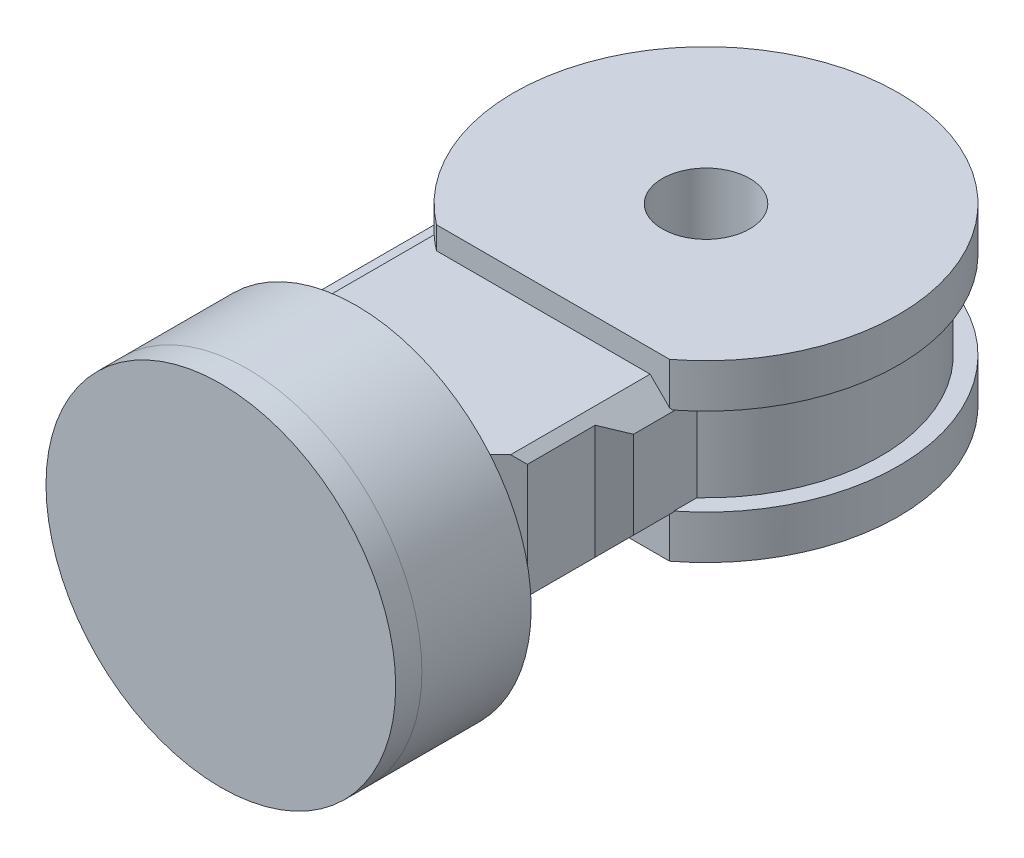
ISO-10303-21;
HEADER;
FILE_DESCRIPTION(('STEP AP214'),'2;1');
FILE_NAME('part.step','',(''),(''),'','','');
FILE_SCHEMA(('AUTOMOTIVE_DESIGN { 1 0 10303 214 1 1 1 1 }'));
ENDSEC;
DATA;
#1=APPLICATION_CONTEXT('core data for automotive mechanical design processes');
#2=APPLICATION_PROTOCOL_DEFINITION('international standard','automotive_design',2000,#1);
#3=PRODUCT_CONTEXT('',#1,'mechanical');
#4=PRODUCT('Part','Part','',(#3));
#5=PRODUCT_RELATED_PRODUCT_CATEGORY('part','',(#4));
#6=PRODUCT_DEFINITION_FORMATION('','',#4);
#7=PRODUCT_DEFINITION_CONTEXT('part definition',#1,'design');
#8=PRODUCT_DEFINITION('design','',#6,#7);
#9=PRODUCT_DEFINITION_SHAPE('','',#8);
#10=(LENGTH_UNIT() NAMED_UNIT(*) SI_UNIT(.MILLI.,.METRE.));
#11=(NAMED_UNIT(*) PLANE_ANGLE_UNIT() SI_UNIT($,.RADIAN.));
#12=(NAMED_UNIT(*) SI_UNIT($,.STERADIAN.) SOLID_ANGLE_UNIT());
#13=UNCERTAINTY_MEASURE_WITH_UNIT(LENGTH_MEASURE(1.E-05),#10,'distance_accuracy_value','');
#14=(GEOMETRIC_REPRESENTATION_CONTEXT(3) GLOBAL_UNCERTAINTY_ASSIGNED_CONTEXT((#13)) GLOBAL_UNIT_ASSIGNED_CONTEXT((#10,
#11,#12)) REPRESENTATION_CONTEXT('',''));
#15=CARTESIAN_POINT('',(0.,0.,0.));
#16=DIRECTION('',(0.,0.,1.));
#17=DIRECTION('',(1.,0.,0.));
#18=AXIS2_PLACEMENT_3D('',#15,#16,#17);
#19=CARTESIAN_POINT('',(-5.87206947568004,-0.00427005103726535,80.));
#20=DIRECTION('',(0.,0.,-1.));
#21=DIRECTION('',(-1.,0.,0.));
#22=AXIS2_PLACEMENT_3D('',#19,#20,#21);
#23=CYLINDRICAL_SURFACE('',#22,17.5);
#24=DIRECTION('',(0.,0.,-1.));
#25=VECTOR('',#24,1.);
#26=CARTESIAN_POINT('',(-14.8859476641298,14.9957299489627,500000.));
#27=LINE('',#26,#25);
#28=CARTESIAN_POINT('',(-14.88594766434,14.9957299489627,80.));
#29=VERTEX_POINT('',#28);
#30=CARTESIAN_POINT('',(-14.88594766434,14.9957299489627,75.));
#31=VERTEX_POINT('',#30);
#32=EDGE_CURVE('E259',#29,#31,#27,.T.);
#33=ORIENTED_EDGE('',*,*,#32,.F.);
#34=CARTESIAN_POINT('',(-5.87206947568004,-0.00427005103726535,80.));
#35=DIRECTION('',(0.,0.,1.));
#36=DIRECTION('',(1.,0.,0.));
#37=AXIS2_PLACEMENT_3D('',#34,#35,#36);
#38=CIRCLE('',#37,17.5);
#39=CARTESIAN_POINT('',(-14.88594766434,-15.0042700510373,80.));
#40=VERTEX_POINT('',#39);
#41=EDGE_CURVE('E281',#40,#29,#38,.T.);
#42=ORIENTED_EDGE('',*,*,#41,.F.);
#43=DIRECTION('',(0.,0.,-1.));
#44=VECTOR('',#43,1.);
#45=CARTESIAN_POINT('',(-14.8859476641298,-15.0042700510373,500000.));
#46=LINE('',#45,#44);
#47=CARTESIAN_POINT('',(-14.88594766434,-15.0042700510373,75.));
#48=VERTEX_POINT('',#47);
#49=EDGE_CURVE('E264',#40,#48,#46,.T.);
#50=ORIENTED_EDGE('',*,*,#49,.T.);
#51=CARTESIAN_POINT('',(-5.87206947568004,-0.00427005103726535,75.));
#52=DIRECTION('',(0.,0.,1.));
#53=DIRECTION('',(1.,0.,0.));
#54=AXIS2_PLACEMENT_3D('',#51,#52,#53);
#55=CIRCLE('',#54,17.5);
#56=CARTESIAN_POINT('',(3.14180871297995,-15.0042700510373,75.));
#57=VERTEX_POINT('',#56);
#58=EDGE_CURVE('E269',#48,#57,#55,.T.);
#59=ORIENTED_EDGE('',*,*,#58,.T.);
#60=CARTESIAN_POINT('',(3.14180871297995,14.9957299489627,75.));
#61=VERTEX_POINT('',#60);
#62=EDGE_CURVE('E288',#57,#61,#55,.T.);
#63=ORIENTED_EDGE('',*,*,#62,.T.);
#64=EDGE_CURVE('E285',#61,#31,#55,.T.);
#65=ORIENTED_EDGE('',*,*,#64,.T.);
#66=EDGE_LOOP('',(#33,#42,#50,#59,#63,#65));
#67=FACE_BOUND('',#66,.T.);
#68=ADVANCED_FACE('F35',(#67),#23,.T.);
#69=CARTESIAN_POINT('',(-40.0988586620535,-15.0042700510373,75.));
#70=DIRECTION('',(0.,0.,-1.));
#71=DIRECTION('',(-1.,0.,0.));
#72=AXIS2_PLACEMENT_3D('',#69,#70,#71);
#73=PLANE('',#72);
#74=DIRECTION('',(1.,0.,0.));
#75=VECTOR('',#74,1.);
#76=CARTESIAN_POINT('',(27.2129675063833,-15.0042700510373,75.));
#77=LINE('',#76,#75);
#78=CARTESIAN_POINT('',(14.12793052432,-15.0042700510373,75.));
#79=VERTEX_POINT('',#78);
#80=EDGE_CURVE('E324',#57,#79,#77,.T.);
#81=ORIENTED_EDGE('',*,*,#80,.T.);
#82=DIRECTION('',(0.,1.,0.));
#83=VECTOR('',#82,1.);
#84=CARTESIAN_POINT('',(14.12793052432,-15.0042700510373,75.));
#85=LINE('',#84,#83);
#86=CARTESIAN_POINT('',(14.12793052432,14.9957299489627,75.));
#87=VERTEX_POINT('',#86);
#88=EDGE_CURVE('E426',#79,#87,#85,.T.);
#89=ORIENTED_EDGE('',*,*,#88,.T.);
#90=DIRECTION('',(-1.,0.,0.));
#91=VECTOR('',#90,1.);
#92=CARTESIAN_POINT('',(27.2129675063833,14.9957299489627,75.));
#93=LINE('',#92,#91);
#94=EDGE_CURVE('E330',#87,#61,#93,.T.);
#95=ORIENTED_EDGE('',*,*,#94,.T.);
#96=ORIENTED_EDGE('',*,*,#62,.F.);
#97=EDGE_LOOP('',(#81,#89,#95,#96));
#98=FACE_BOUND('',#97,.T.);
#99=ADVANCED_FACE('F517',(#98),#73,.F.);
#100=CARTESIAN_POINT('',(27.2129675063833,14.9957299489627,5.));
#101=DIRECTION('',(0.,1.,0.));
#102=DIRECTION('',(0.,0.,1.));
#103=AXIS2_PLACEMENT_3D('',#100,#101,#102);
#104=PLANE('',#103);
#105=DIRECTION('',(-0.707106781186547,0.,0.707106781186549));
#106=VECTOR('',#105,1.);
#107=CARTESIAN_POINT('',(55.6704490153516,14.9957299489627,33.4574815089682));
#108=LINE('',#107,#106);
#109=CARTESIAN_POINT('',(22.2129675063833,14.9957299489627,66.9149630179367));
#110=VERTEX_POINT('',#109);
#111=EDGE_CURVE('E429',#87,#110,#108,.F.);
#112=ORIENTED_EDGE('',*,*,#111,.T.);
#113=DIRECTION('',(0.,0.,-1.));
#114=VECTOR('',#113,1.);
#115=CARTESIAN_POINT('',(22.2129675063833,14.9957299489627,5.));
#116=LINE('',#115,#114);
#117=CARTESIAN_POINT('',(22.2129675063833,14.9957299489627,35.));
#118=VERTEX_POINT('',#117);
#119=EDGE_CURVE('E454',#110,#118,#116,.T.);
#120=ORIENTED_EDGE('',*,*,#119,.T.);
#121=DIRECTION('',(1.,0.,0.));
#122=VECTOR('',#121,1.);
#123=CARTESIAN_POINT('',(44.0697477523933,14.9957299489627,35.));
#124=LINE('',#123,#122);
#125=CARTESIAN_POINT('',(-26.6645832519468,14.9957299489627,35.));
#126=VERTEX_POINT('',#125);
#127=EDGE_CURVE('E385',#126,#118,#124,.T.);
#128=ORIENTED_EDGE('',*,*,#127,.F.);
#129=CARTESIAN_POINT('',(0.,14.9957299489627,0.));
#130=DIRECTION('',(0.,1.,0.));
#131=DIRECTION('',(0.,0.,1.));
#132=AXIS2_PLACEMENT_3D('',#129,#130,#131);
#133=CIRCLE('',#132,44.);
#134=CARTESIAN_POINT('',(-30.0988586620535,14.9957299489627,32.0945276837302));
#135=VERTEX_POINT('',#134);
#136=EDGE_CURVE('E336',#135,#126,#133,.T.);
#137=ORIENTED_EDGE('',*,*,#136,.F.);
#138=DIRECTION('',(0.,0.,-1.));
#139=VECTOR('',#138,1.);
#140=CARTESIAN_POINT('',(-30.0988586620535,14.9957299489627,84.7338096233384));
#141=LINE('',#140,#139);
#142=CARTESIAN_POINT('',(-30.0988586620535,14.9957299489627,80.0000000000001));
#143=VERTEX_POINT('',#142);
#144=EDGE_CURVE('E302',#143,#135,#141,.T.);
#145=ORIENTED_EDGE('',*,*,#144,.F.);
#146=DIRECTION('',(-1.,0.,0.));
#147=VECTOR('',#146,1.);
#148=CARTESIAN_POINT('',(-30.0988586620535,14.9957299489627,79.9999999999841));
#149=LINE('',#148,#147);
#150=EDGE_CURVE('E276',#29,#143,#149,.T.);
#151=ORIENTED_EDGE('',*,*,#150,.F.);
#152=ORIENTED_EDGE('',*,*,#32,.T.);
#153=EDGE_CURVE('E333',#61,#31,#93,.T.);
#154=ORIENTED_EDGE('',*,*,#153,.F.);
#155=ORIENTED_EDGE('',*,*,#94,.F.);
#156=EDGE_LOOP('',(#112,#120,#128,#137,#145,#151,#152,#154,#155));
#157=FACE_BOUND('',#156,.T.);
#158=ADVANCED_FACE('F557',(#157),#104,.T.);
#159=CARTESIAN_POINT('',(44.0697477523933,-19.84,35.));
#160=DIRECTION('',(0.,0.,-1.));
#161=DIRECTION('',(-1.,0.,0.));
#162=AXIS2_PLACEMENT_3D('',#159,#160,#161);
#163=PLANE('',#162);
#164=DIRECTION('',(0.,-1.,0.));
#165=VECTOR('',#164,1.);
#166=CARTESIAN_POINT('',(26.6645832519468,-9.84,35.));
#167=LINE('',#166,#165);
#168=CARTESIAN_POINT('',(26.6645832519468,-10.5526543054738,35.));
#169=VERTEX_POINT('',#168);
#170=CARTESIAN_POINT('',(26.6645832519468,-19.84,35.));
#171=VERTEX_POINT('',#170);
#172=EDGE_CURVE('E62',#169,#171,#167,.T.);
#173=ORIENTED_EDGE('',*,*,#172,.F.);
#174=DIRECTION('',(0.707106781186546,0.707106781186549,0.));
#175=VECTOR('',#174,1.);
#176=CARTESIAN_POINT('',(30.7234926549069,-6.49374490251366,35.));
#177=LINE('',#176,#175);
#178=CARTESIAN_POINT('',(22.2129675063833,-15.0042700510373,35.));
#179=VERTEX_POINT('',#178);
#180=EDGE_CURVE('E11',#169,#179,#177,.F.);
#181=ORIENTED_EDGE('',*,*,#180,.T.);
#182=DIRECTION('',(-1.,0.,0.));
#183=VECTOR('',#182,1.);
#184=CARTESIAN_POINT('',(44.0697477523933,-15.0042700510373,35.));
#185=LINE('',#184,#183);
#186=CARTESIAN_POINT('',(-26.6645832519468,-15.0042700510373,35.));
#187=VERTEX_POINT('',#186);
#188=EDGE_CURVE('E388',#179,#187,#185,.T.);
#189=ORIENTED_EDGE('',*,*,#188,.T.);
#190=DIRECTION('',(0.,-1.,0.));
#191=VECTOR('',#190,1.);
#192=CARTESIAN_POINT('',(-26.6645832519468,-9.84,35.));
#193=LINE('',#192,#191);
#194=CARTESIAN_POINT('',(-26.6645832519468,-19.84,35.));
#195=VERTEX_POINT('',#194);
#196=EDGE_CURVE('E363',#195,#187,#193,.F.);
#197=ORIENTED_EDGE('',*,*,#196,.F.);
#198=DIRECTION('',(-1.,0.,0.));
#199=VECTOR('',#198,1.);
#200=CARTESIAN_POINT('',(44.0697477523933,-19.84,35.));
#201=LINE('',#200,#199);
#202=EDGE_CURVE('E358',#171,#195,#201,.T.);
#203=ORIENTED_EDGE('',*,*,#202,.F.);
#204=EDGE_LOOP('',(#173,#181,#189,#197,#203));
#205=FACE_BOUND('',#204,.T.);
#206=ADVANCED_FACE('F571',(#205),#163,.F.);
#207=CARTESIAN_POINT('',(0.,-9.84,0.));
#208=DIRECTION('',(0.,1.,0.));
#209=DIRECTION('',(0.,0.,1.));
#210=AXIS2_PLACEMENT_3D('',#207,#208,#209);
#211=PLANE('',#210);
#212=DIRECTION('',(0.,0.,-1.));
#213=VECTOR('',#212,1.);
#214=CARTESIAN_POINT('',(27.2129675063833,-9.84,0.));
#215=LINE('',#214,#213);
#216=CARTESIAN_POINT('',(27.2129675063833,-9.84,34.5753438087972));
#217=VERTEX_POINT('',#216);
#218=CARTESIAN_POINT('',(27.2129675063833,-9.84,29.3164527099806));
#219=VERTEX_POINT('',#218);
#220=EDGE_CURVE('E345',#217,#219,#215,.T.);
#221=ORIENTED_EDGE('',*,*,#220,.F.);
#222=CARTESIAN_POINT('',(0.,-9.84,0.));
#223=DIRECTION('',(0.,1.,0.));
#224=DIRECTION('',(0.,0.,1.));
#225=AXIS2_PLACEMENT_3D('',#222,#223,#224);
#226=CIRCLE('',#225,44.);
#227=CARTESIAN_POINT('',(-43.454624110608,-9.84,6.90620325546293));
#228=VERTEX_POINT('',#227);
#229=EDGE_CURVE('E381',#217,#228,#226,.T.);
#230=ORIENTED_EDGE('',*,*,#229,.T.);
#231=DIRECTION('',(0.766044443118978,0.,0.64278760968654));
#232=VECTOR('',#231,1.);
#233=CARTESIAN_POINT('',(-21.3550451662288,-9.84,25.4499517968647));
#234=LINE('',#233,#232);
#235=CARTESIAN_POINT('',(-40.0988586620535,-9.84,9.72202480566247));
#236=VERTEX_POINT('',#235);
#237=EDGE_CURVE('E409',#236,#228,#234,.F.);
#238=ORIENTED_EDGE('',*,*,#237,.F.);
#239=DIRECTION('',(0.,0.,1.));
#240=VECTOR('',#239,1.);
#241=CARTESIAN_POINT('',(-40.0988586620535,-9.84,0.));
#242=LINE('',#241,#240);
#243=CARTESIAN_POINT('',(-40.0988586620535,-9.84,5.00000000000002));
#244=VERTEX_POINT('',#243);
#245=EDGE_CURVE('E356',#244,#236,#242,.T.);
#246=ORIENTED_EDGE('',*,*,#245,.F.);
#247=DIRECTION('',(-1.,0.,0.));
#248=VECTOR('',#247,1.);
#249=CARTESIAN_POINT('',(0.,-9.84,5.));
#250=LINE('',#249,#248);
#251=CARTESIAN_POINT('',(-39.6862696659689,-9.84,5.00000000000002));
#252=VERTEX_POINT('',#251);
#253=EDGE_CURVE('E355',#252,#244,#250,.T.);
#254=ORIENTED_EDGE('',*,*,#253,.F.);
#255=CARTESIAN_POINT('',(0.,-9.84,0.));
#256=DIRECTION('',(0.,1.,0.));
#257=DIRECTION('',(0.,0.,1.));
#258=AXIS2_PLACEMENT_3D('',#255,#256,#257);
#259=CIRCLE('',#258,40.);
#260=EDGE_CURVE('E373',#219,#252,#259,.T.);
#261=ORIENTED_EDGE('',*,*,#260,.F.);
#262=EDGE_LOOP('',(#221,#230,#238,#246,#254,#261));
#263=FACE_BOUND('',#262,.T.);
#264=ADVANCED_FACE('F599',(#263),#211,.T.);
#265=CARTESIAN_POINT('',(0.,-9.84,0.));
#266=DIRECTION('',(0.,-1.,0.));
#267=DIRECTION('',(0.,0.,-1.));
#268=AXIS2_PLACEMENT_3D('',#265,#266,#267);
#269=CYLINDRICAL_SURFACE('',#268,44.);
#270=CARTESIAN_POINT('',(0.,-19.84,0.));
#271=DIRECTION('',(0.,1.,0.));
#272=DIRECTION('',(0.,0.,1.));
#273=AXIS2_PLACEMENT_3D('',#270,#271,#272);
#274=CIRCLE('',#273,44.);
#275=EDGE_CURVE('E377',#171,#195,#274,.T.);
#276=ORIENTED_EDGE('',*,*,#275,.T.);
#277=ORIENTED_EDGE('',*,*,#196,.T.);
#278=CARTESIAN_POINT('',(0.,-15.0042700510373,0.));
#279=DIRECTION('',(0.,-1.,0.));
#280=DIRECTION('',(0.,0.,-1.));
#281=AXIS2_PLACEMENT_3D('',#278,#279,#280);
#282=CIRCLE('',#281,44.);
#283=CARTESIAN_POINT('',(-30.0988586620535,-15.0042700510373,32.0945276837302));
#284=VERTEX_POINT('',#283);
#285=EDGE_CURVE('E340',#187,#284,#282,.T.);
#286=ORIENTED_EDGE('',*,*,#285,.T.);
#287=CARTESIAN_POINT('',(0.,-15.0042700510372,0.));
#288=DIRECTION('',(0.,-1.,0.));
#289=DIRECTION('',(1.,0.,0.));
#290=AXIS2_PLACEMENT_3D('',#287,#288,#289);
#291=CIRCLE('',#290,44.);
#292=CARTESIAN_POINT('',(-43.454624110608,-15.0042700510373,6.90620325546295));
#293=VERTEX_POINT('',#292);
#294=EDGE_CURVE('E406',#284,#293,#291,.T.);
#295=ORIENTED_EDGE('',*,*,#294,.T.);
#296=DIRECTION('',(0.,-1.,0.));
#297=VECTOR('',#296,1.);
#298=CARTESIAN_POINT('',(-43.454624110608,-9.83999999999999,6.90620325546293));
#299=LINE('',#298,#297);
#300=EDGE_CURVE('E396',#293,#228,#299,.F.);
#301=ORIENTED_EDGE('',*,*,#300,.T.);
#302=ORIENTED_EDGE('',*,*,#229,.F.);
#303=DIRECTION('',(0.,-1.,0.));
#304=VECTOR('',#303,1.);
#305=CARTESIAN_POINT('',(27.2129675063833,-9.84,34.5753438087972));
#306=LINE('',#305,#304);
#307=CARTESIAN_POINT('',(27.2129675063833,-10.0042700510373,34.5753438087972));
#308=VERTEX_POINT('',#307);
#309=EDGE_CURVE('E348',#217,#308,#306,.T.);
#310=ORIENTED_EDGE('',*,*,#309,.T.);
#311=CARTESIAN_POINT('',(0.,-37.2172375574207,0.));
#312=DIRECTION('',(-0.70710678118655,0.707106781186546,0.));
#313=DIRECTION('',(-0.707106781186546,-0.707106781186549,0.));
#314=AXIS2_PLACEMENT_3D('',#311,#312,#313);
#315=ELLIPSE('',#314,62.2253967444164,44.);
#316=EDGE_CURVE('E47',#308,#169,#315,.F.);
#317=ORIENTED_EDGE('',*,*,#316,.T.);
#318=ORIENTED_EDGE('',*,*,#172,.T.);
#319=EDGE_LOOP('',(#276,#277,#286,#295,#301,#302,#310,#317,#318));
#320=FACE_BOUND('',#319,.T.);
#321=ADVANCED_FACE('F602',(#320),#269,.T.);
#322=CARTESIAN_POINT('',(0.,-19.84,0.));
#323=DIRECTION('',(0.,1.,0.));
#324=DIRECTION('',(0.,0.,1.));
#325=AXIS2_PLACEMENT_3D('',#322,#323,#324);
#326=PLANE('',#325);
#327=CARTESIAN_POINT('',(0.,-19.84,0.));
#328=DIRECTION('',(0.,1.,0.));
#329=DIRECTION('',(0.,0.,1.));
#330=AXIS2_PLACEMENT_3D('',#327,#328,#329);
#331=CIRCLE('',#330,10.);
#332=CARTESIAN_POINT('',(0.,-19.84,10.));
#333=VERTEX_POINT('',#332);
#334=EDGE_CURVE('E313',#333,#333,#331,.T.);
#335=ORIENTED_EDGE('',*,*,#334,.T.);
#336=EDGE_LOOP('',(#335));
#337=FACE_BOUND('',#336,.T.);
#338=ORIENTED_EDGE('',*,*,#275,.F.);
#339=ORIENTED_EDGE('',*,*,#202,.T.);
#340=EDGE_LOOP('',(#338,#339));
#341=FACE_BOUND('',#340,.T.);
#342=ADVANCED_FACE('F597',(#337,#341),#326,.F.);
#343=CARTESIAN_POINT('',(0.,10.16,0.));
#344=DIRECTION('',(0.,-1.,0.));
#345=DIRECTION('',(0.,0.,-1.));
#346=AXIS2_PLACEMENT_3D('',#343,#344,#345);
#347=CYLINDRICAL_SURFACE('',#346,40.);
#348=CARTESIAN_POINT('',(0.,10.16,0.));
#349=DIRECTION('',(0.,1.,0.));
#350=DIRECTION('',(0.,0.,1.));
#351=AXIS2_PLACEMENT_3D('',#348,#349,#350);
#352=CIRCLE('',#351,40.);
#353=CARTESIAN_POINT('',(27.048697455346,10.16,29.4680838530292));
#354=VERTEX_POINT('',#353);
#355=CARTESIAN_POINT('',(-39.6862696659689,10.16,5.00000000000002));
#356=VERTEX_POINT('',#355);
#357=EDGE_CURVE('E374',#354,#356,#352,.T.);
#358=ORIENTED_EDGE('',*,*,#357,.F.);
#359=CARTESIAN_POINT('',(0.,37.2086974553459,0.));
#360=DIRECTION('',(-0.707106781186546,-0.707106781186549,0.));
#361=DIRECTION('',(0.70710678118655,-0.707106781186546,0.));
#362=AXIS2_PLACEMENT_3D('',#359,#360,#361);
#363=ELLIPSE('',#362,56.5685424949236,40.);
#364=CARTESIAN_POINT('',(27.2129675063833,9.99572994896276,29.3164527099806));
#365=VERTEX_POINT('',#364);
#366=EDGE_CURVE('E468',#354,#365,#363,.F.);
#367=ORIENTED_EDGE('',*,*,#366,.T.);
#368=DIRECTION('',(0.,-1.,0.));
#369=VECTOR('',#368,1.);
#370=CARTESIAN_POINT('',(27.2129675063833,10.16,29.3164527099806));
#371=LINE('',#370,#369);
#372=EDGE_CURVE('E343',#365,#219,#371,.T.);
#373=ORIENTED_EDGE('',*,*,#372,.T.);
#374=ORIENTED_EDGE('',*,*,#260,.T.);
#375=DIRECTION('',(0.,-1.,0.));
#376=VECTOR('',#375,1.);
#377=CARTESIAN_POINT('',(-39.6862696659689,10.16,5.00000000000002));
#378=LINE('',#377,#376);
#379=EDGE_CURVE('E352',#252,#356,#378,.F.);
#380=ORIENTED_EDGE('',*,*,#379,.T.);
#381=EDGE_LOOP('',(#358,#367,#373,#374,#380));
#382=FACE_BOUND('',#381,.T.);
#383=ADVANCED_FACE('F590',(#382),#347,.T.);
#384=CARTESIAN_POINT('',(0.,10.16,0.));
#385=DIRECTION('',(0.,1.,0.));
#386=DIRECTION('',(0.,0.,1.));
#387=AXIS2_PLACEMENT_3D('',#384,#385,#386);
#388=PLANE('',#387);
#389=CARTESIAN_POINT('',(0.,10.16,0.));
#390=DIRECTION('',(0.,1.,0.));
#391=DIRECTION('',(0.,0.,1.));
#392=AXIS2_PLACEMENT_3D('',#389,#390,#391);
#393=CIRCLE('',#392,44.);
#394=CARTESIAN_POINT('',(27.048697455346,10.16,34.7040050422017));
#395=VERTEX_POINT('',#394);
#396=CARTESIAN_POINT('',(-43.454624110608,10.16,6.90620325546297));
#397=VERTEX_POINT('',#396);
#398=EDGE_CURVE('E369',#395,#397,#393,.T.);
#399=ORIENTED_EDGE('',*,*,#398,.F.);
#400=DIRECTION('',(0.,0.,1.));
#401=VECTOR('',#400,1.);
#402=CARTESIAN_POINT('',(27.048697455346,10.16,0.));
#403=LINE('',#402,#401);
#404=EDGE_CURVE('E465',#395,#354,#403,.F.);
#405=ORIENTED_EDGE('',*,*,#404,.T.);
#406=ORIENTED_EDGE('',*,*,#357,.T.);
#407=DIRECTION('',(-1.,0.,0.));
#408=VECTOR('',#407,1.);
#409=CARTESIAN_POINT('',(0.,10.16,5.));
#410=LINE('',#409,#408);
#411=CARTESIAN_POINT('',(-40.0988586620535,10.16,5.00000000000002));
#412=VERTEX_POINT('',#411);
#413=EDGE_CURVE('E391',#356,#412,#410,.T.);
#414=ORIENTED_EDGE('',*,*,#413,.T.);
#415=DIRECTION('',(0.,0.,1.));
#416=VECTOR('',#415,1.);
#417=CARTESIAN_POINT('',(-40.0988586620535,10.16,0.));
#418=LINE('',#417,#416);
#419=CARTESIAN_POINT('',(-40.0988586620535,10.16,9.72202480566249));
#420=VERTEX_POINT('',#419);
#421=EDGE_CURVE('E351',#412,#420,#418,.T.);
#422=ORIENTED_EDGE('',*,*,#421,.T.);
#423=DIRECTION('',(-0.766044443118978,0.,-0.64278760968654));
#424=VECTOR('',#423,1.);
#425=CARTESIAN_POINT('',(-30.0988586620535,10.16,18.1130211174353));
#426=LINE('',#425,#424);
#427=EDGE_CURVE('E394',#397,#420,#426,.F.);
#428=ORIENTED_EDGE('',*,*,#427,.F.);
#429=EDGE_LOOP('',(#399,#405,#406,#414,#422,#428));
#430=FACE_BOUND('',#429,.T.);
#431=ADVANCED_FACE('F587',(#430),#388,.F.);
#432=CARTESIAN_POINT('',(0.,20.16,0.));
#433=DIRECTION('',(0.,-1.,0.));
#434=DIRECTION('',(0.,0.,-1.));
#435=AXIS2_PLACEMENT_3D('',#432,#433,#434);
#436=CYLINDRICAL_SURFACE('',#435,44.);
#437=ORIENTED_EDGE('',*,*,#398,.T.);
#438=DIRECTION('',(0.,-1.,0.));
#439=VECTOR('',#438,1.);
#440=CARTESIAN_POINT('',(-43.454624110608,20.16,6.90620325546297));
#441=LINE('',#440,#439);
#442=CARTESIAN_POINT('',(-43.454624110608,14.9957299489627,6.90620325546297));
#443=VERTEX_POINT('',#442);
#444=EDGE_CURVE('E390',#397,#443,#441,.F.);
#445=ORIENTED_EDGE('',*,*,#444,.T.);
#446=EDGE_CURVE('E337',#443,#135,#133,.T.);
#447=ORIENTED_EDGE('',*,*,#446,.T.);
#448=ORIENTED_EDGE('',*,*,#136,.T.);
#449=DIRECTION('',(0.,-1.,0.));
#450=VECTOR('',#449,1.);
#451=CARTESIAN_POINT('',(-26.6645832519468,20.16,35.));
#452=LINE('',#451,#450);
#453=CARTESIAN_POINT('',(-26.6645832519468,20.16,35.));
#454=VERTEX_POINT('',#453);
#455=EDGE_CURVE('E361',#126,#454,#452,.F.);
#456=ORIENTED_EDGE('',*,*,#455,.T.);
#457=CARTESIAN_POINT('',(0.,20.16,0.));
#458=DIRECTION('',(0.,1.,0.));
#459=DIRECTION('',(0.,0.,1.));
#460=AXIS2_PLACEMENT_3D('',#457,#458,#459);
#461=CIRCLE('',#460,44.);
#462=CARTESIAN_POINT('',(26.6645832519468,20.16,35.));
#463=VERTEX_POINT('',#462);
#464=EDGE_CURVE('E370',#463,#454,#461,.T.);
#465=ORIENTED_EDGE('',*,*,#464,.F.);
#466=DIRECTION('',(0.,-1.,0.));
#467=VECTOR('',#466,1.);
#468=CARTESIAN_POINT('',(26.6645832519468,20.16,35.));
#469=LINE('',#468,#467);
#470=CARTESIAN_POINT('',(26.6645832519468,10.5441142033992,35.));
#471=VERTEX_POINT('',#470);
#472=EDGE_CURVE('E366',#463,#471,#469,.T.);
#473=ORIENTED_EDGE('',*,*,#472,.T.);
#474=CARTESIAN_POINT('',(0.,37.2086974553459,0.));
#475=DIRECTION('',(-0.707106781186546,-0.707106781186549,0.));
#476=DIRECTION('',(0.70710678118655,-0.707106781186546,0.));
#477=AXIS2_PLACEMENT_3D('',#474,#475,#476);
#478=ELLIPSE('',#477,62.225396744416,44.);
#479=EDGE_CURVE('E462',#471,#395,#478,.F.);
#480=ORIENTED_EDGE('',*,*,#479,.T.);
#481=EDGE_LOOP('',(#437,#445,#447,#448,#456,#465,#473,#480));
#482=FACE_BOUND('',#481,.T.);
#483=ADVANCED_FACE('F585',(#482),#436,.T.);
#484=CARTESIAN_POINT('',(0.,20.16,0.));
#485=DIRECTION('',(0.,1.,0.));
#486=DIRECTION('',(0.,0.,1.));
#487=AXIS2_PLACEMENT_3D('',#484,#485,#486);
#488=PLANE('',#487);
#489=CARTESIAN_POINT('',(0.,20.16,0.));
#490=DIRECTION('',(0.,1.,0.));
#491=DIRECTION('',(0.,0.,1.));
#492=AXIS2_PLACEMENT_3D('',#489,#490,#491);
#493=CIRCLE('',#492,10.);
#494=CARTESIAN_POINT('',(0.,20.16,10.));
#495=VERTEX_POINT('',#494);
#496=EDGE_CURVE('E317',#495,#495,#493,.T.);
#497=ORIENTED_EDGE('',*,*,#496,.F.);
#498=EDGE_LOOP('',(#497));
#499=FACE_BOUND('',#498,.T.);
#500=DIRECTION('',(-1.,0.,0.));
#501=VECTOR('',#500,1.);
#502=CARTESIAN_POINT('',(0.,20.16,35.));
#503=LINE('',#502,#501);
#504=EDGE_CURVE('E382',#463,#454,#503,.T.);
#505=ORIENTED_EDGE('',*,*,#504,.F.);
#506=ORIENTED_EDGE('',*,*,#464,.T.);
#507=EDGE_LOOP('',(#505,#506));
#508=FACE_BOUND('',#507,.T.);
#509=ADVANCED_FACE('F581',(#499,#508),#488,.T.);
#510=ORIENTED_EDGE('',*,*,#455,.F.);
#511=ORIENTED_EDGE('',*,*,#127,.T.);
#512=DIRECTION('',(-0.70710678118655,0.707106781186546,0.));
#513=VECTOR('',#512,1.);
#514=CARTESIAN_POINT('',(50.5592226038697,-13.3505251485236,35.));
#515=LINE('',#514,#513);
#516=EDGE_CURVE('E459',#118,#471,#515,.F.);
#517=ORIENTED_EDGE('',*,*,#516,.T.);
#518=ORIENTED_EDGE('',*,*,#472,.F.);
#519=ORIENTED_EDGE('',*,*,#504,.T.);
#520=EDGE_LOOP('',(#510,#511,#517,#518,#519));
#521=FACE_BOUND('',#520,.T.);
#522=ADVANCED_FACE('F567',(#521),#163,.F.);
#523=CARTESIAN_POINT('',(-40.0988586620535,-15.0042700510373,5.00000000000002));
#524=DIRECTION('',(-1.,0.,0.));
#525=DIRECTION('',(0.,-1.,0.));
#526=AXIS2_PLACEMENT_3D('',#523,#524,#525);
#527=PLANE('',#526);
#528=DIRECTION('',(0.,1.,0.));
#529=VECTOR('',#528,1.);
#530=CARTESIAN_POINT('',(-40.0988586620535,-15.0042700510373,9.72202480566248));
#531=LINE('',#530,#529);
#532=CARTESIAN_POINT('',(-40.0988586620535,-6.97369252550356,9.72202480566247));
#533=VERTEX_POINT('',#532);
#534=EDGE_CURVE('E291',#533,#236,#531,.F.);
#535=ORIENTED_EDGE('',*,*,#534,.F.);
#536=DIRECTION('',(0.,0.,-1.));
#537=VECTOR('',#536,1.);
#538=CARTESIAN_POINT('',(-40.0988586620535,-6.97369252550357,84.7338096233384));
#539=LINE('',#538,#537);
#540=CARTESIAN_POINT('',(-40.0988586620535,-6.97369252550357,80.0000000000001));
#541=VERTEX_POINT('',#540);
#542=EDGE_CURVE('E284',#541,#533,#539,.T.);
#543=ORIENTED_EDGE('',*,*,#542,.F.);
#544=DIRECTION('',(0.,-1.,0.));
#545=VECTOR('',#544,1.);
#546=CARTESIAN_POINT('',(-40.0988586620535,6.96515242342905,79.9999999999841));
#547=LINE('',#546,#545);
#548=CARTESIAN_POINT('',(-40.0988586620535,6.96515242342905,80.0000000000001));
#549=VERTEX_POINT('',#548);
#550=EDGE_CURVE('E232',#549,#541,#547,.T.);
#551=ORIENTED_EDGE('',*,*,#550,.F.);
#552=DIRECTION('',(0.,0.,1.));
#553=VECTOR('',#552,1.);
#554=CARTESIAN_POINT('',(-40.0988586620535,6.96515242342905,84.7338096233384));
#555=LINE('',#554,#553);
#556=CARTESIAN_POINT('',(-40.0988586620535,6.96515242342904,9.7220248056625));
#557=VERTEX_POINT('',#556);
#558=EDGE_CURVE('E303',#557,#549,#555,.T.);
#559=ORIENTED_EDGE('',*,*,#558,.F.);
#560=DIRECTION('',(0.,1.,0.));
#561=VECTOR('',#560,1.);
#562=CARTESIAN_POINT('',(-40.0988586620535,-15.0042700510373,9.72202480566248));
#563=LINE('',#562,#561);
#564=EDGE_CURVE('E312',#420,#557,#563,.F.);
#565=ORIENTED_EDGE('',*,*,#564,.F.);
#566=ORIENTED_EDGE('',*,*,#421,.F.);
#567=DIRECTION('',(0.,-1.,0.));
#568=VECTOR('',#567,1.);
#569=CARTESIAN_POINT('',(-40.0988586620535,-15.0042700510373,5.00000000000002));
#570=LINE('',#569,#568);
#571=EDGE_CURVE('E332',#412,#244,#570,.T.);
#572=ORIENTED_EDGE('',*,*,#571,.T.);
#573=ORIENTED_EDGE('',*,*,#245,.T.);
#574=EDGE_LOOP('',(#535,#543,#551,#559,#565,#566,#572,#573));
#575=FACE_BOUND('',#574,.T.);
#576=ADVANCED_FACE('F563',(#575),#527,.T.);
#577=CARTESIAN_POINT('',(27.2129675063833,-15.0042700510373,5.));
#578=DIRECTION('',(1.,0.,0.));
#579=DIRECTION('',(0.,0.,-1.));
#580=AXIS2_PLACEMENT_3D('',#577,#578,#579);
#581=PLANE('',#580);
#582=ORIENTED_EDGE('',*,*,#372,.F.);
#583=DIRECTION('',(0.,0.,1.));
#584=VECTOR('',#583,1.);
#585=CARTESIAN_POINT('',(27.2129675063833,9.99572994896276,5.));
#586=LINE('',#585,#584);
#587=CARTESIAN_POINT('',(27.2129675063833,9.99572994896275,43.805218586097));
#588=VERTEX_POINT('',#587);
#589=EDGE_CURVE('E439',#365,#588,#586,.T.);
#590=ORIENTED_EDGE('',*,*,#589,.T.);
#591=DIRECTION('',(0.,1.,0.));
#592=VECTOR('',#591,1.);
#593=CARTESIAN_POINT('',(27.2129675063833,-25.0042700510373,43.805218586097));
#594=LINE('',#593,#592);
#595=CARTESIAN_POINT('',(27.2129675063833,-10.0042700510373,43.805218586097));
#596=VERTEX_POINT('',#595);
#597=EDGE_CURVE('E316',#596,#588,#594,.T.);
#598=ORIENTED_EDGE('',*,*,#597,.F.);
#599=DIRECTION('',(0.,0.,-1.));
#600=VECTOR('',#599,1.);
#601=CARTESIAN_POINT('',(27.2129675063833,-10.0042700510373,5.));
#602=LINE('',#601,#600);
#603=EDGE_CURVE('E437',#596,#308,#602,.T.);
#604=ORIENTED_EDGE('',*,*,#603,.T.);
#605=ORIENTED_EDGE('',*,*,#309,.F.);
#606=ORIENTED_EDGE('',*,*,#220,.T.);
#607=EDGE_LOOP('',(#582,#590,#598,#604,#605,#606));
#608=FACE_BOUND('',#607,.T.);
#609=ADVANCED_FACE('F566',(#608),#581,.T.);
#610=CARTESIAN_POINT('',(27.2129675063833,-15.0042700510373,5.));
#611=DIRECTION('',(0.,-1.,0.));
#612=DIRECTION('',(0.,0.,-1.));
#613=AXIS2_PLACEMENT_3D('',#610,#611,#612);
#614=PLANE('',#613);
#615=ORIENTED_EDGE('',*,*,#188,.F.);
#616=DIRECTION('',(0.,0.,1.));
#617=VECTOR('',#616,1.);
#618=CARTESIAN_POINT('',(22.2129675063833,-15.0042700510373,5.));
#619=LINE('',#618,#617);
#620=CARTESIAN_POINT('',(22.2129675063834,-15.0042700510373,66.9149630179366));
#621=VERTEX_POINT('',#620);
#622=EDGE_CURVE('E456',#179,#621,#619,.T.);
#623=ORIENTED_EDGE('',*,*,#622,.T.);
#624=DIRECTION('',(0.707106781186547,0.,-0.707106781186549));
#625=VECTOR('',#624,1.);
#626=CARTESIAN_POINT('',(55.6704490153516,-15.0042700510373,33.4574815089682));
#627=LINE('',#626,#625);
#628=EDGE_CURVE('E435',#621,#79,#627,.F.);
#629=ORIENTED_EDGE('',*,*,#628,.T.);
#630=ORIENTED_EDGE('',*,*,#80,.F.);
#631=EDGE_CURVE('E329',#48,#57,#77,.T.);
#632=ORIENTED_EDGE('',*,*,#631,.F.);
#633=ORIENTED_EDGE('',*,*,#49,.F.);
#634=DIRECTION('',(1.,0.,0.));
#635=VECTOR('',#634,1.);
#636=CARTESIAN_POINT('',(-30.0988586620535,-15.0042700510373,79.9999999999841));
#637=LINE('',#636,#635);
#638=CARTESIAN_POINT('',(-30.0988586620535,-15.0042700510373,80.0000000000001));
#639=VERTEX_POINT('',#638);
#640=EDGE_CURVE('E266',#639,#40,#637,.T.);
#641=ORIENTED_EDGE('',*,*,#640,.F.);
#642=DIRECTION('',(0.,0.,1.));
#643=VECTOR('',#642,1.);
#644=CARTESIAN_POINT('',(-30.0988586620535,-15.0042700510373,84.7338096233384));
#645=LINE('',#644,#643);
#646=EDGE_CURVE('E294',#284,#639,#645,.T.);
#647=ORIENTED_EDGE('',*,*,#646,.F.);
#648=ORIENTED_EDGE('',*,*,#285,.F.);
#649=EDGE_LOOP('',(#615,#623,#629,#630,#632,#633,#641,#647,#648));
#650=FACE_BOUND('',#649,.T.);
#651=ADVANCED_FACE('F561',(#650),#614,.T.);
#652=CARTESIAN_POINT('',(-40.0988586620535,-15.0042700510373,5.00000000000002));
#653=DIRECTION('',(0.,0.,-1.));
#654=DIRECTION('',(-1.,0.,0.));
#655=AXIS2_PLACEMENT_3D('',#652,#653,#654);
#656=PLANE('',#655);
#657=ORIENTED_EDGE('',*,*,#379,.F.);
#658=ORIENTED_EDGE('',*,*,#253,.T.);
#659=ORIENTED_EDGE('',*,*,#571,.F.);
#660=ORIENTED_EDGE('',*,*,#413,.F.);
#661=EDGE_LOOP('',(#657,#658,#659,#660));
#662=FACE_BOUND('',#661,.T.);
#663=ADVANCED_FACE('F550',(#662),#656,.T.);
#664=CARTESIAN_POINT('',(24.12793052432,-25.0042700510373,49.4880973388311));
#665=DIRECTION('',(-1.,0.,0.));
#666=DIRECTION('',(0.,-1.,0.));
#667=AXIS2_PLACEMENT_3D('',#664,#665,#666);
#668=PLANE('',#667);
#669=DIRECTION('',(0.,1.,0.));
#670=VECTOR('',#669,1.);
#671=CARTESIAN_POINT('',(24.12793052432,-25.0042700510373,49.4880973388311));
#672=LINE('',#671,#670);
#673=CARTESIAN_POINT('',(24.12793052432,-13.0893070331006,49.4880973388311));
#674=VERTEX_POINT('',#673);
#675=CARTESIAN_POINT('',(24.12793052432,13.0807669310261,49.4880973388311));
#676=VERTEX_POINT('',#675);
#677=EDGE_CURVE('E321',#674,#676,#672,.T.);
#678=ORIENTED_EDGE('',*,*,#677,.T.);
#679=DIRECTION('',(0.,0.,-1.));
#680=VECTOR('',#679,1.);
#681=CARTESIAN_POINT('',(24.1279305243199,13.0807669310261,4.99999999999999));
#682=LINE('',#681,#680);
#683=CARTESIAN_POINT('',(24.12793052432,13.0807669310261,65.));
#684=VERTEX_POINT('',#683);
#685=EDGE_CURVE('E448',#676,#684,#682,.F.);
#686=ORIENTED_EDGE('',*,*,#685,.T.);
#687=DIRECTION('',(0.,-1.,0.));
#688=VECTOR('',#687,1.);
#689=CARTESIAN_POINT('',(24.12793052432,-25.0042700510373,65.));
#690=LINE('',#689,#688);
#691=CARTESIAN_POINT('',(24.12793052432,-13.0893070331006,65.));
#692=VERTEX_POINT('',#691);
#693=EDGE_CURVE('E432',#684,#692,#690,.T.);
#694=ORIENTED_EDGE('',*,*,#693,.T.);
#695=DIRECTION('',(0.,0.,1.));
#696=VECTOR('',#695,1.);
#697=CARTESIAN_POINT('',(24.1279305243199,-13.0893070331006,5.));
#698=LINE('',#697,#696);
#699=EDGE_CURVE('E446',#692,#674,#698,.F.);
#700=ORIENTED_EDGE('',*,*,#699,.T.);
#701=EDGE_LOOP('',(#678,#686,#694,#700));
#702=FACE_BOUND('',#701,.T.);
#703=ADVANCED_FACE('F547',(#702),#668,.F.);
#704=CARTESIAN_POINT('',(27.2129675063833,-25.0042700510373,43.805218586097));
#705=DIRECTION('',(-0.878850470959097,0.,-0.477097316797082));
#706=DIRECTION('',(-0.477097316797082,0.,0.878850470959096));
#707=AXIS2_PLACEMENT_3D('',#704,#705,#706);
#708=PLANE('',#707);
#709=ORIENTED_EDGE('',*,*,#597,.T.);
#710=DIRECTION('',(0.430600638336864,-0.430600638336862,-0.793199962511202));
#711=VECTOR('',#710,1.);
#712=CARTESIAN_POINT('',(40.4669834422632,-3.25828598691706,19.390287423737));
#713=LINE('',#712,#711);
#714=EDGE_CURVE('E444',#588,#676,#713,.F.);
#715=ORIENTED_EDGE('',*,*,#714,.T.);
#716=ORIENTED_EDGE('',*,*,#677,.F.);
#717=DIRECTION('',(-0.430600638336863,-0.430600638336866,0.793199962511201));
#718=VECTOR('',#717,1.);
#719=CARTESIAN_POINT('',(38.612814344902,1.39557678748149,22.8058115255981));
#720=LINE('',#719,#718);
#721=EDGE_CURVE('E442',#674,#596,#720,.F.);
#722=ORIENTED_EDGE('',*,*,#721,.T.);
#723=EDGE_LOOP('',(#709,#715,#716,#722));
#724=FACE_BOUND('',#723,.T.);
#725=ADVANCED_FACE('F545',(#724),#708,.F.);
#726=CARTESIAN_POINT('',(0.,-19.84,0.));
#727=DIRECTION('',(0.,1.,0.));
#728=DIRECTION('',(0.,0.,1.));
#729=AXIS2_PLACEMENT_3D('',#726,#727,#728);
#730=CYLINDRICAL_SURFACE('',#729,10.);
#731=ORIENTED_EDGE('',*,*,#334,.F.);
#732=EDGE_LOOP('',(#731));
#733=FACE_BOUND('',#732,.T.);
#734=ORIENTED_EDGE('',*,*,#496,.T.);
#735=EDGE_LOOP('',(#734));
#736=FACE_BOUND('',#735,.T.);
#737=ADVANCED_FACE('F538',(#733,#736),#730,.F.);
#738=CARTESIAN_POINT('',(-30.0988586620535,6.96515242342905,84.7338096233384));
#739=DIRECTION('',(0.,-1.,0.));
#740=DIRECTION('',(1.,0.,0.));
#741=AXIS2_PLACEMENT_3D('',#738,#739,#740);
#742=PLANE('',#741);
#743=DIRECTION('',(0.,0.,1.));
#744=VECTOR('',#743,1.);
#745=CARTESIAN_POINT('',(-30.0988586620535,6.96515242342905,84.7338096233384));
#746=LINE('',#745,#744);
#747=CARTESIAN_POINT('',(-30.0988586620535,6.96515242342904,18.1130211174353));
#748=VERTEX_POINT('',#747);
#749=CARTESIAN_POINT('',(-30.0988586619542,6.96515242342905,80.0000000000001));
#750=VERTEX_POINT('',#749);
#751=EDGE_CURVE('E307',#748,#750,#746,.T.);
#752=ORIENTED_EDGE('',*,*,#751,.F.);
#753=DIRECTION('',(0.766044443118978,0.,0.64278760968654));
#754=VECTOR('',#753,1.);
#755=CARTESIAN_POINT('',(-30.0988586620535,6.96515242342904,18.1130211174353));
#756=LINE('',#755,#754);
#757=EDGE_CURVE('E320',#748,#557,#756,.F.);
#758=ORIENTED_EDGE('',*,*,#757,.T.);
#759=ORIENTED_EDGE('',*,*,#558,.T.);
#760=DIRECTION('',(-1.,0.,0.));
#761=VECTOR('',#760,1.);
#762=CARTESIAN_POINT('',(-40.0988586620535,6.96515242342905,79.9999999999841));
#763=LINE('',#762,#761);
#764=CARTESIAN_POINT('',(-39.3881600277596,6.96515242342905,80.0000000000001));
#765=VERTEX_POINT('',#764);
#766=EDGE_CURVE('E273',#765,#549,#763,.T.);
#767=ORIENTED_EDGE('',*,*,#766,.F.);
#768=EDGE_CURVE('E252',#750,#765,#763,.T.);
#769=ORIENTED_EDGE('',*,*,#768,.F.);
#770=EDGE_LOOP('',(#752,#758,#759,#767,#769));
#771=FACE_BOUND('',#770,.T.);
#772=ADVANCED_FACE('F535',(#771),#742,.F.);
#773=CARTESIAN_POINT('',(-30.0988586620535,14.9957299489627,84.7338096233384));
#774=DIRECTION('',(0.,1.,0.));
#775=DIRECTION('',(-1.,0.,0.));
#776=AXIS2_PLACEMENT_3D('',#773,#774,#775);
#777=PLANE('',#776);
#778=DIRECTION('',(0.766044443118978,0.,0.64278760968654));
#779=VECTOR('',#778,1.);
#780=CARTESIAN_POINT('',(2.70547585414649,14.9957299489627,45.6391261109948));
#781=LINE('',#780,#779);
#782=CARTESIAN_POINT('',(-30.0988586620535,14.9957299489627,18.1130211174353));
#783=VERTEX_POINT('',#782);
#784=EDGE_CURVE('E309',#783,#443,#781,.F.);
#785=ORIENTED_EDGE('',*,*,#784,.F.);
#786=EDGE_CURVE('E300',#135,#783,#141,.T.);
#787=ORIENTED_EDGE('',*,*,#786,.F.);
#788=ORIENTED_EDGE('',*,*,#446,.F.);
#789=EDGE_LOOP('',(#785,#787,#788));
#790=FACE_BOUND('',#789,.T.);
#791=ADVANCED_FACE('F533',(#790),#777,.F.);
#792=CARTESIAN_POINT('',(-30.0988586620535,14.9957299489627,84.7338096233384));
#793=DIRECTION('',(-1.,0.,0.));
#794=DIRECTION('',(0.,0.,1.));
#795=AXIS2_PLACEMENT_3D('',#792,#793,#794);
#796=PLANE('',#795);
#797=ORIENTED_EDGE('',*,*,#751,.T.);
#798=DIRECTION('',(0.,-1.,0.));
#799=VECTOR('',#798,1.);
#800=CARTESIAN_POINT('',(-30.0988586620535,6.96515242342904,79.9999999999841));
#801=LINE('',#800,#799);
#802=EDGE_CURVE('E274',#143,#750,#801,.T.);
#803=ORIENTED_EDGE('',*,*,#802,.F.);
#804=ORIENTED_EDGE('',*,*,#144,.T.);
#805=ORIENTED_EDGE('',*,*,#786,.T.);
#806=DIRECTION('',(0.,-1.,0.));
#807=VECTOR('',#806,1.);
#808=CARTESIAN_POINT('',(-30.0988586620535,6.96515242342904,18.1130211174353));
#809=LINE('',#808,#807);
#810=EDGE_CURVE('E304',#783,#748,#809,.T.);
#811=ORIENTED_EDGE('',*,*,#810,.T.);
#812=EDGE_LOOP('',(#797,#803,#804,#805,#811));
#813=FACE_BOUND('',#812,.T.);
#814=ADVANCED_FACE('F530',(#813),#796,.T.);
#815=CARTESIAN_POINT('',(-30.0988586620535,6.96515242342904,18.1130211174353));
#816=DIRECTION('',(-0.64278760968654,0.,0.766044443118978));
#817=DIRECTION('',(0.766044443118978,0.,0.64278760968654));
#818=AXIS2_PLACEMENT_3D('',#815,#816,#817);
#819=PLANE('',#818);
#820=ORIENTED_EDGE('',*,*,#444,.F.);
#821=ORIENTED_EDGE('',*,*,#427,.T.);
#822=ORIENTED_EDGE('',*,*,#564,.T.);
#823=ORIENTED_EDGE('',*,*,#757,.F.);
#824=ORIENTED_EDGE('',*,*,#810,.F.);
#825=ORIENTED_EDGE('',*,*,#784,.T.);
#826=EDGE_LOOP('',(#820,#821,#822,#823,#824,#825));
#827=FACE_BOUND('',#826,.T.);
#828=ADVANCED_FACE('F526',(#827),#819,.T.);
#829=CARTESIAN_POINT('',(-30.0988586620535,-15.0042700510373,84.7338096233384));
#830=DIRECTION('',(0.,-1.,0.));
#831=DIRECTION('',(1.,0.,0.));
#832=AXIS2_PLACEMENT_3D('',#829,#830,#831);
#833=PLANE('',#832);
#834=CARTESIAN_POINT('',(-30.0988586620535,-15.0042700510373,18.1130211174353));
#835=VERTEX_POINT('',#834);
#836=EDGE_CURVE('E295',#835,#284,#645,.T.);
#837=ORIENTED_EDGE('',*,*,#836,.F.);
#838=DIRECTION('',(0.766044443118978,0.,0.64278760968654));
#839=VECTOR('',#838,1.);
#840=CARTESIAN_POINT('',(-30.0988586620535,-15.0042700510373,18.1130211174353));
#841=LINE('',#840,#839);
#842=EDGE_CURVE('E412',#835,#293,#841,.F.);
#843=ORIENTED_EDGE('',*,*,#842,.T.);
#844=ORIENTED_EDGE('',*,*,#294,.F.);
#845=EDGE_LOOP('',(#837,#843,#844));
#846=FACE_BOUND('',#845,.T.);
#847=ADVANCED_FACE('F523',(#846),#833,.F.);
#848=CARTESIAN_POINT('',(-30.0988586620535,-6.97369252550357,84.7338096233384));
#849=DIRECTION('',(0.,1.,0.));
#850=DIRECTION('',(-1.,0.,0.));
#851=AXIS2_PLACEMENT_3D('',#848,#849,#850);
#852=PLANE('',#851);
#853=ORIENTED_EDGE('',*,*,#542,.T.);
#854=DIRECTION('',(0.766044443118978,0.,0.64278760968654));
#855=VECTOR('',#854,1.);
#856=CARTESIAN_POINT('',(2.70547585414651,-6.97369252550355,45.6391261109949));
#857=LINE('',#856,#855);
#858=CARTESIAN_POINT('',(-30.0988586620535,-6.97369252550356,18.1130211174353));
#859=VERTEX_POINT('',#858);
#860=EDGE_CURVE('E298',#859,#533,#857,.F.);
#861=ORIENTED_EDGE('',*,*,#860,.F.);
#862=DIRECTION('',(0.,0.,-1.));
#863=VECTOR('',#862,1.);
#864=CARTESIAN_POINT('',(-30.0988586620535,-6.97369252550357,84.7338096233384));
#865=LINE('',#864,#863);
#866=CARTESIAN_POINT('',(-30.0988586620535,-6.97369252550357,80.));
#867=VERTEX_POINT('',#866);
#868=EDGE_CURVE('E242',#867,#859,#865,.T.);
#869=ORIENTED_EDGE('',*,*,#868,.F.);
#870=DIRECTION('',(1.,0.,0.));
#871=VECTOR('',#870,1.);
#872=CARTESIAN_POINT('',(-30.0988586620535,-6.97369252550357,79.9999999999841));
#873=LINE('',#872,#871);
#874=CARTESIAN_POINT('',(-39.3881600277596,-6.97369252550357,80.0000000000001));
#875=VERTEX_POINT('',#874);
#876=EDGE_CURVE('E236',#875,#867,#873,.T.);
#877=ORIENTED_EDGE('',*,*,#876,.F.);
#878=EDGE_CURVE('E228',#541,#875,#873,.T.);
#879=ORIENTED_EDGE('',*,*,#878,.F.);
#880=EDGE_LOOP('',(#853,#861,#869,#877,#879));
#881=FACE_BOUND('',#880,.T.);
#882=ADVANCED_FACE('F240',(#881),#852,.F.);
#883=CARTESIAN_POINT('',(-30.0988586620535,-15.0042700510373,84.7338096233384));
#884=DIRECTION('',(1.,0.,0.));
#885=DIRECTION('',(0.,1.,0.));
#886=AXIS2_PLACEMENT_3D('',#883,#884,#885);
#887=PLANE('',#886);
#888=ORIENTED_EDGE('',*,*,#868,.T.);
#889=DIRECTION('',(0.,-1.,0.));
#890=VECTOR('',#889,1.);
#891=CARTESIAN_POINT('',(-30.0988586620535,-6.97369252550356,18.1130211174353));
#892=LINE('',#891,#890);
#893=EDGE_CURVE('E290',#859,#835,#892,.T.);
#894=ORIENTED_EDGE('',*,*,#893,.T.);
#895=ORIENTED_EDGE('',*,*,#836,.T.);
#896=ORIENTED_EDGE('',*,*,#646,.T.);
#897=DIRECTION('',(0.,-1.,0.));
#898=VECTOR('',#897,1.);
#899=CARTESIAN_POINT('',(-30.0988586620535,-15.0042700510373,79.9999999999841));
#900=LINE('',#899,#898);
#901=EDGE_CURVE('E235',#867,#639,#900,.T.);
#902=ORIENTED_EDGE('',*,*,#901,.F.);
#903=EDGE_LOOP('',(#888,#894,#895,#896,#902));
#904=FACE_BOUND('',#903,.T.);
#905=ADVANCED_FACE('F519',(#904),#887,.F.);
#906=CARTESIAN_POINT('',(-30.0988586620535,-6.97369252550356,18.1130211174353));
#907=DIRECTION('',(-0.64278760968654,0.,0.766044443118978));
#908=DIRECTION('',(0.766044443118978,0.,0.64278760968654));
#909=AXIS2_PLACEMENT_3D('',#906,#907,#908);
#910=PLANE('',#909);
#911=ORIENTED_EDGE('',*,*,#534,.T.);
#912=ORIENTED_EDGE('',*,*,#237,.T.);
#913=ORIENTED_EDGE('',*,*,#300,.F.);
#914=ORIENTED_EDGE('',*,*,#842,.F.);
#915=ORIENTED_EDGE('',*,*,#893,.F.);
#916=ORIENTED_EDGE('',*,*,#860,.T.);
#917=EDGE_LOOP('',(#911,#912,#913,#914,#915,#916));
#918=FACE_BOUND('',#917,.T.);
#919=ADVANCED_FACE('F513',(#918),#910,.T.);
#920=CARTESIAN_POINT('',(-5.87206947568004,-0.00427005103726535,75.));
#921=DIRECTION('',(0.,0.,1.));
#922=DIRECTION('',(1.,0.,0.));
#923=AXIS2_PLACEMENT_3D('',#920,#921,#922);
#924=PLANE('',#923);
#925=ORIENTED_EDGE('',*,*,#58,.F.);
#926=ORIENTED_EDGE('',*,*,#631,.T.);
#927=EDGE_LOOP('',(#925,#926));
#928=FACE_BOUND('',#927,.T.);
#929=ADVANCED_FACE('F509',(#928),#924,.F.);
#930=ORIENTED_EDGE('',*,*,#64,.F.);
#931=ORIENTED_EDGE('',*,*,#153,.T.);
#932=EDGE_LOOP('',(#930,#931));
#933=FACE_BOUND('',#932,.T.);
#934=ADVANCED_FACE('F512',(#933),#924,.F.);
#935=CARTESIAN_POINT('',(14.12793052432,-15.0042700510373,75.));
#936=DIRECTION('',(-0.707106781186549,0.,-0.707106781186547));
#937=DIRECTION('',(-0.707106781186547,0.,0.707106781186549));
#938=AXIS2_PLACEMENT_3D('',#935,#936,#937);
#939=PLANE('',#938);
#940=ORIENTED_EDGE('',*,*,#693,.F.);
#941=DIRECTION('',(-0.577350269189626,0.577350269189623,0.577350269189628));
#942=VECTOR('',#941,1.);
#943=CARTESIAN_POINT('',(26.8229428516743,10.3857546036717,62.3049876726456));
#944=LINE('',#943,#942);
#945=EDGE_CURVE('E452',#684,#110,#944,.T.);
#946=ORIENTED_EDGE('',*,*,#945,.T.);
#947=ORIENTED_EDGE('',*,*,#111,.F.);
#948=ORIENTED_EDGE('',*,*,#88,.F.);
#949=ORIENTED_EDGE('',*,*,#628,.F.);
#950=DIRECTION('',(0.577350269189624,0.577350269189627,-0.577350269189626));
#951=VECTOR('',#950,1.);
#952=CARTESIAN_POINT('',(16.8229428516744,-20.3942947057462,72.3049876726455));
#953=LINE('',#952,#951);
#954=EDGE_CURVE('E450',#621,#692,#953,.T.);
#955=ORIENTED_EDGE('',*,*,#954,.T.);
#956=EDGE_LOOP('',(#940,#946,#947,#948,#949,#955));
#957=FACE_BOUND('',#956,.T.);
#958=ADVANCED_FACE('F616',(#957),#939,.F.);
#959=CARTESIAN_POINT('',(27.2129675063833,9.99572994896276,5.));
#960=DIRECTION('',(-0.707106781186546,-0.707106781186549,0.));
#961=DIRECTION('',(0.70710678118655,-0.707106781186546,0.));
#962=AXIS2_PLACEMENT_3D('',#959,#960,#961);
#963=PLANE('',#962);
#964=ORIENTED_EDGE('',*,*,#516,.F.);
#965=ORIENTED_EDGE('',*,*,#119,.F.);
#966=ORIENTED_EDGE('',*,*,#945,.F.);
#967=ORIENTED_EDGE('',*,*,#685,.F.);
#968=ORIENTED_EDGE('',*,*,#714,.F.);
#969=ORIENTED_EDGE('',*,*,#589,.F.);
#970=ORIENTED_EDGE('',*,*,#366,.F.);
#971=ORIENTED_EDGE('',*,*,#404,.F.);
#972=ORIENTED_EDGE('',*,*,#479,.F.);
#973=EDGE_LOOP('',(#964,#965,#966,#967,#968,#969,#970,#971,#972));
#974=FACE_BOUND('',#973,.T.);
#975=ADVANCED_FACE('F618',(#974),#963,.F.);
#976=CARTESIAN_POINT('',(22.2129675063833,-15.0042700510373,5.));
#977=DIRECTION('',(-0.70710678118655,0.707106781186546,0.));
#978=DIRECTION('',(-0.707106781186546,-0.707106781186549,0.));
#979=AXIS2_PLACEMENT_3D('',#976,#977,#978);
#980=PLANE('',#979);
#981=ORIENTED_EDGE('',*,*,#316,.F.);
#982=ORIENTED_EDGE('',*,*,#603,.F.);
#983=ORIENTED_EDGE('',*,*,#721,.F.);
#984=ORIENTED_EDGE('',*,*,#699,.F.);
#985=ORIENTED_EDGE('',*,*,#954,.F.);
#986=ORIENTED_EDGE('',*,*,#622,.F.);
#987=ORIENTED_EDGE('',*,*,#180,.F.);
#988=EDGE_LOOP('',(#981,#982,#983,#984,#985,#986,#987));
#989=FACE_BOUND('',#988,.T.);
#990=ADVANCED_FACE('F37',(#989),#980,.F.);
#991=CARTESIAN_POINT('',(-11.5209826677187,11.4624151978952,80.));
#992=DIRECTION('',(0.,0.,1.));
#993=DIRECTION('',(1.,0.,0.));
#994=AXIS2_PLACEMENT_3D('',#991,#992,#993);
#995=PLANE('',#994);
#996=CARTESIAN_POINT('',(0.,-0.00427005103726535,80.));
#997=DIRECTION('',(0.,0.,1.));
#998=DIRECTION('',(1.,0.,0.));
#999=AXIS2_PLACEMENT_3D('',#996,#997,#998);
#1000=CIRCLE('',#999,40.);
#1001=EDGE_CURVE('E55',#765,#875,#1000,.T.);
#1002=ORIENTED_EDGE('',*,*,#1001,.F.);
#1003=ORIENTED_EDGE('',*,*,#766,.T.);
#1004=ORIENTED_EDGE('',*,*,#550,.T.);
#1005=ORIENTED_EDGE('',*,*,#878,.T.);
#1006=EDGE_LOOP('',(#1002,#1003,#1004,#1005));
#1007=FACE_BOUND('',#1006,.T.);
#1008=ADVANCED_FACE('F230',(#1007),#995,.T.);
#1009=CARTESIAN_POINT('',(0.,-0.00427005103726535,80.));
#1010=DIRECTION('',(0.,0.,1.));
#1011=DIRECTION('',(1.,0.,0.));
#1012=AXIS2_PLACEMENT_3D('',#1009,#1010,#1011);
#1013=PLANE('',#1012);
#1014=ORIENTED_EDGE('',*,*,#802,.T.);
#1015=ORIENTED_EDGE('',*,*,#768,.T.);
#1016=EDGE_CURVE('E248',#875,#765,#1000,.T.);
#1017=ORIENTED_EDGE('',*,*,#1016,.F.);
#1018=ORIENTED_EDGE('',*,*,#876,.T.);
#1019=ORIENTED_EDGE('',*,*,#901,.T.);
#1020=ORIENTED_EDGE('',*,*,#640,.T.);
#1021=ORIENTED_EDGE('',*,*,#41,.T.);
#1022=ORIENTED_EDGE('',*,*,#150,.T.);
#1023=EDGE_LOOP('',(#1014,#1015,#1017,#1018,#1019,#1020,#1021,#1022));
#1024=FACE_BOUND('',#1023,.T.);
#1025=ADVANCED_FACE('F250',(#1024),#1013,.F.);
#1026=CARTESIAN_POINT('',(0.,-0.00427005103726535,105.));
#1027=DIRECTION('',(0.,0.,-1.));
#1028=DIRECTION('',(-1.,0.,0.));
#1029=AXIS2_PLACEMENT_3D('',#1026,#1027,#1028);
#1030=CYLINDRICAL_SURFACE('',#1029,40.);
#1031=CARTESIAN_POINT('',(0.,0.,105.));
#1032=DIRECTION('',(0.,0.,1.));
#1033=DIRECTION('',(1.,0.,0.));
#1034=AXIS2_PLACEMENT_3D('',#1031,#1032,#1033);
#1035=CIRCLE('',#1034,40.);
#1036=CARTESIAN_POINT('',(40.,0.,105.));
#1037=VERTEX_POINT('',#1036);
#1038=EDGE_CURVE('E257',#1037,#1037,#1035,.T.);
#1039=ORIENTED_EDGE('',*,*,#1038,.F.);
#1040=EDGE_LOOP('',(#1039));
#1041=FACE_BOUND('',#1040,.T.);
#1042=ORIENTED_EDGE('',*,*,#1001,.T.);
#1043=ORIENTED_EDGE('',*,*,#1016,.T.);
#1044=EDGE_LOOP('',(#1042,#1043));
#1045=FACE_BOUND('',#1044,.T.);
#1046=ADVANCED_FACE('F256',(#1041,#1045),#1030,.T.);
#1047=CARTESIAN_POINT('',(0.,0.,111.));
#1048=DIRECTION('',(0.,0.,-1.));
#1049=DIRECTION('',(-1.,0.,0.));
#1050=AXIS2_PLACEMENT_3D('',#1047,#1048,#1049);
#1051=CYLINDRICAL_SURFACE('',#1050,40.);
#1052=CARTESIAN_POINT('',(0.,0.,111.));
#1053=DIRECTION('',(0.,0.,1.));
#1054=DIRECTION('',(1.,0.,0.));
#1055=AXIS2_PLACEMENT_3D('',#1052,#1053,#1054);
#1056=CIRCLE('',#1055,40.);
#1057=CARTESIAN_POINT('',(40.,0.,111.));
#1058=VERTEX_POINT('',#1057);
#1059=EDGE_CURVE('E477',#1058,#1058,#1056,.T.);
#1060=ORIENTED_EDGE('',*,*,#1059,.F.);
#1061=EDGE_LOOP('',(#1060));
#1062=FACE_BOUND('',#1061,.T.);
#1063=ORIENTED_EDGE('',*,*,#1038,.T.);
#1064=EDGE_LOOP('',(#1063));
#1065=FACE_BOUND('',#1064,.T.);
#1066=ADVANCED_FACE('F474',(#1062,#1065),#1051,.T.);
#1067=CARTESIAN_POINT('',(0.,0.,111.));
#1068=DIRECTION('',(0.,0.,1.));
#1069=DIRECTION('',(1.,0.,0.));
#1070=AXIS2_PLACEMENT_3D('',#1067,#1068,#1069);
#1071=PLANE('',#1070);
#1072=ORIENTED_EDGE('',*,*,#1059,.T.);
#1073=EDGE_LOOP('',(#1072));
#1074=FACE_BOUND('',#1073,.T.);
#1075=ADVANCED_FACE('F490',(#1074),#1071,.T.);
#1076=CLOSED_SHELL('',(#68,#99,#158,#206,#264,#321,#342,#383,#431,#483,#509,#522,#576,#609,#651,
#663,#703,#725,#737,#772,#791,#814,#828,#847,#882,#905,#919,#929,#934,#958,#975,#990,#1008,
#1025,#1046,#1066,#1075));
#1077=CARTESIAN_POINT('',(0.,-0.00427005103726535,95.));
#1078=DIRECTION('',(0.,0.,1.));
#1079=DIRECTION('',(1.,0.,0.));
#1080=AXIS2_PLACEMENT_3D('',#1077,#1078,#1079);
#1081=PLANE('',#1080);
#1082=CARTESIAN_POINT('',(0.,-0.00427005103726535,95.));
#1083=DIRECTION('',(0.,0.,1.));
#1084=DIRECTION('',(1.,0.,0.));
#1085=AXIS2_PLACEMENT_3D('',#1082,#1083,#1084);
#1086=CIRCLE('',#1085,10.);
#1087=CARTESIAN_POINT('',(10.,-0.00427005103726535,95.));
#1088=VERTEX_POINT('',#1087);
#1089=EDGE_CURVE('E254',#1088,#1088,#1086,.T.);
#1090=ORIENTED_EDGE('',*,*,#1089,.T.);
#1091=EDGE_LOOP('',(#1090));
#1092=FACE_BOUND('',#1091,.T.);
#1093=ADVANCED_FACE('F494',(#1092),#1081,.T.);
#1094=CARTESIAN_POINT('',(0.,-0.00427005103726535,95.));
#1095=DIRECTION('',(0.,0.,1.));
#1096=DIRECTION('',(1.,0.,0.));
#1097=AXIS2_PLACEMENT_3D('',#1094,#1095,#1096);
#1098=CYLINDRICAL_SURFACE('',#1097,10.);
#1099=ORIENTED_EDGE('',*,*,#1089,.F.);
#1100=EDGE_LOOP('',(#1099));
#1101=FACE_BOUND('',#1100,.T.);
#1102=CARTESIAN_POINT('',(0.,-0.00427005103726535,105.));
#1103=DIRECTION('',(0.,0.,1.));
#1104=DIRECTION('',(1.,0.,0.));
#1105=AXIS2_PLACEMENT_3D('',#1102,#1103,#1104);
#1106=CIRCLE('',#1105,10.);
#1107=CARTESIAN_POINT('',(10.,-0.00427005103726535,105.));
#1108=VERTEX_POINT('',#1107);
#1109=EDGE_CURVE('E262',#1108,#1108,#1106,.T.);
#1110=ORIENTED_EDGE('',*,*,#1109,.T.);
#1111=EDGE_LOOP('',(#1110));
#1112=FACE_BOUND('',#1111,.T.);
#1113=ADVANCED_FACE('F497',(#1101,#1112),#1098,.F.);
#1114=CARTESIAN_POINT('',(0.,0.,105.));
#1115=DIRECTION('',(0.,0.,1.));
#1116=DIRECTION('',(1.,0.,0.));
#1117=AXIS2_PLACEMENT_3D('',#1114,#1115,#1116);
#1118=PLANE('',#1117);
#1119=ORIENTED_EDGE('',*,*,#1109,.F.);
#1120=EDGE_LOOP('',(#1119));
#1121=FACE_BOUND('',#1120,.T.);
#1122=ADVANCED_FACE('F492',(#1121),#1118,.F.);
#1123=CLOSED_SHELL('',(#1093,#1113,#1122));
#1124=ORIENTED_CLOSED_SHELL('',*,#1123,.T.);
#1125=BREP_WITH_VOIDS('B2',#1076,(#1124));
#1126=ADVANCED_BREP_SHAPE_REPRESENTATION('',(#18,#1125),#14);
#1127=SHAPE_DEFINITION_REPRESENTATION(#9,#1126);
ENDSEC;
END-ISO-10303-21;
